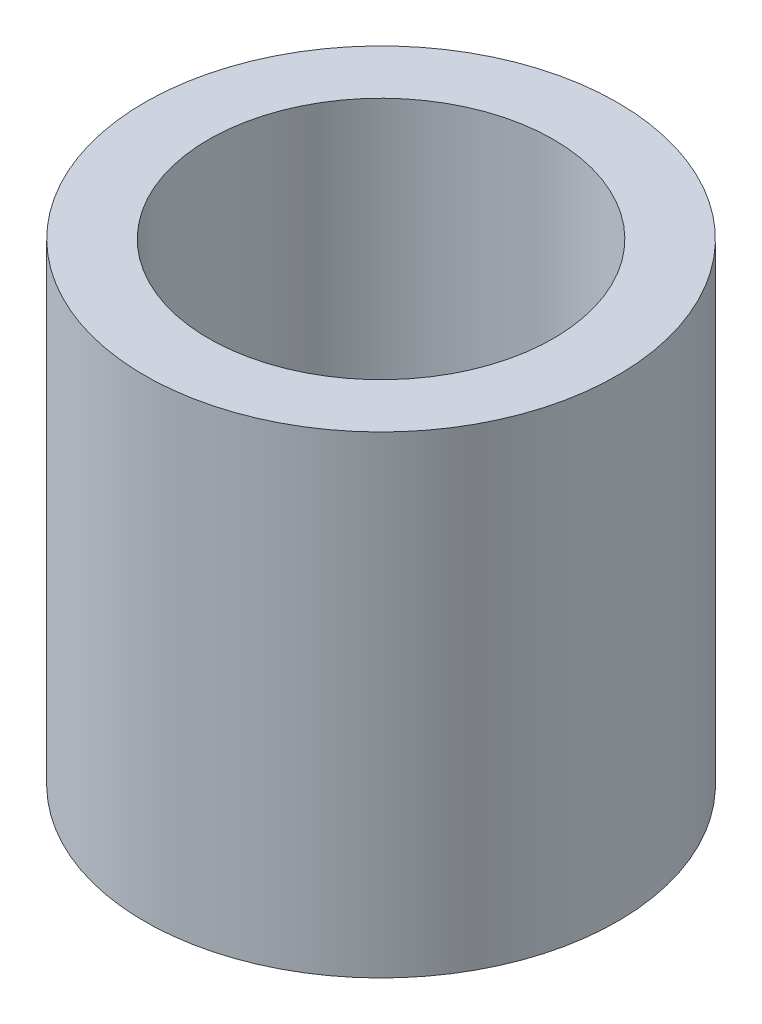
ISO-10303-21;
HEADER;
FILE_DESCRIPTION(('STEP AP214'),'2;1');
FILE_NAME('part.step','',(''),(''),'','','');
FILE_SCHEMA(('AUTOMOTIVE_DESIGN { 1 0 10303 214 1 1 1 1 }'));
ENDSEC;
DATA;
#1=APPLICATION_CONTEXT('core data for automotive mechanical design processes');
#2=APPLICATION_PROTOCOL_DEFINITION('international standard','automotive_design',2000,#1);
#3=PRODUCT_CONTEXT('',#1,'mechanical');
#4=PRODUCT('Part','Part','',(#3));
#5=PRODUCT_RELATED_PRODUCT_CATEGORY('part','',(#4));
#6=PRODUCT_DEFINITION_FORMATION('','',#4);
#7=PRODUCT_DEFINITION_CONTEXT('part definition',#1,'design');
#8=PRODUCT_DEFINITION('design','',#6,#7);
#9=PRODUCT_DEFINITION_SHAPE('','',#8);
#10=(LENGTH_UNIT() NAMED_UNIT(*) SI_UNIT(.MILLI.,.METRE.));
#11=(NAMED_UNIT(*) PLANE_ANGLE_UNIT() SI_UNIT($,.RADIAN.));
#12=(NAMED_UNIT(*) SI_UNIT($,.STERADIAN.) SOLID_ANGLE_UNIT());
#13=UNCERTAINTY_MEASURE_WITH_UNIT(LENGTH_MEASURE(1.E-05),#10,'distance_accuracy_value','');
#14=(GEOMETRIC_REPRESENTATION_CONTEXT(3) GLOBAL_UNCERTAINTY_ASSIGNED_CONTEXT((#13)) GLOBAL_UNIT_ASSIGNED_CONTEXT((#10,
#11,#12)) REPRESENTATION_CONTEXT('',''));
#15=CARTESIAN_POINT('',(0.,0.,0.));
#16=DIRECTION('',(0.,0.,1.));
#17=DIRECTION('',(1.,0.,0.));
#18=AXIS2_PLACEMENT_3D('',#15,#16,#17);
#19=CARTESIAN_POINT('',(0.,0.,0.));
#20=DIRECTION('',(0.,-1.,0.));
#21=DIRECTION('',(0.,0.,-1.));
#22=AXIS2_PLACEMENT_3D('',#19,#20,#21);
#23=CYLINDRICAL_SURFACE('',#22,1.2192);
#24=CARTESIAN_POINT('',(0.,2.4384,0.));
#25=DIRECTION('',(0.,-1.,0.));
#26=DIRECTION('',(0.,0.,-1.));
#27=AXIS2_PLACEMENT_3D('',#24,#25,#26);
#28=CIRCLE('',#27,1.2192);
#29=CARTESIAN_POINT('',(0.,2.4384,-1.2192));
#30=VERTEX_POINT('',#29);
#31=EDGE_CURVE('E10',#30,#30,#28,.T.);
#32=ORIENTED_EDGE('',*,*,#31,.T.);
#33=EDGE_LOOP('',(#32));
#34=FACE_BOUND('',#33,.T.);
#35=CARTESIAN_POINT('',(0.,0.,0.));
#36=DIRECTION('',(0.,-1.,0.));
#37=DIRECTION('',(0.,0.,-1.));
#38=AXIS2_PLACEMENT_3D('',#35,#36,#37);
#39=CIRCLE('',#38,1.2192);
#40=CARTESIAN_POINT('',(0.,0.,-1.2192));
#41=VERTEX_POINT('',#40);
#42=EDGE_CURVE('E46',#41,#41,#39,.T.);
#43=ORIENTED_EDGE('',*,*,#42,.F.);
#44=EDGE_LOOP('',(#43));
#45=FACE_BOUND('',#44,.T.);
#46=ADVANCED_FACE('F32',(#34,#45),#23,.T.);
#47=CARTESIAN_POINT('',(1.2192,2.4384,0.));
#48=DIRECTION('',(0.,1.,0.));
#49=DIRECTION('',(0.,0.,1.));
#50=AXIS2_PLACEMENT_3D('',#47,#48,#49);
#51=PLANE('',#50);
#52=CARTESIAN_POINT('',(0.,2.4384,0.));
#53=DIRECTION('',(0.,-1.,0.));
#54=DIRECTION('',(0.,0.,-1.));
#55=AXIS2_PLACEMENT_3D('',#52,#53,#54);
#56=CIRCLE('',#55,0.889);
#57=CARTESIAN_POINT('',(0.,2.4384,-0.889));
#58=VERTEX_POINT('',#57);
#59=EDGE_CURVE('E38',#58,#58,#56,.T.);
#60=ORIENTED_EDGE('',*,*,#59,.T.);
#61=EDGE_LOOP('',(#60));
#62=FACE_BOUND('',#61,.T.);
#63=ORIENTED_EDGE('',*,*,#31,.F.);
#64=EDGE_LOOP('',(#63));
#65=FACE_BOUND('',#64,.T.);
#66=ADVANCED_FACE('F56',(#62,#65),#51,.T.);
#67=CARTESIAN_POINT('',(0.,0.,0.));
#68=DIRECTION('',(0.,-1.,0.));
#69=DIRECTION('',(0.,0.,-1.));
#70=AXIS2_PLACEMENT_3D('',#67,#68,#69);
#71=CYLINDRICAL_SURFACE('',#70,0.889);
#72=CARTESIAN_POINT('',(0.,0.,0.));
#73=DIRECTION('',(0.,-1.,0.));
#74=DIRECTION('',(0.,0.,-1.));
#75=AXIS2_PLACEMENT_3D('',#72,#73,#74);
#76=CIRCLE('',#75,0.889);
#77=CARTESIAN_POINT('',(0.,0.,-0.889));
#78=VERTEX_POINT('',#77);
#79=EDGE_CURVE('E42',#78,#78,#76,.T.);
#80=ORIENTED_EDGE('',*,*,#79,.T.);
#81=EDGE_LOOP('',(#80));
#82=FACE_BOUND('',#81,.T.);
#83=ORIENTED_EDGE('',*,*,#59,.F.);
#84=EDGE_LOOP('',(#83));
#85=FACE_BOUND('',#84,.T.);
#86=ADVANCED_FACE('F60',(#82,#85),#71,.F.);
#87=CARTESIAN_POINT('',(1.2192,0.,0.));
#88=DIRECTION('',(0.,-1.,0.));
#89=DIRECTION('',(0.,0.,-1.));
#90=AXIS2_PLACEMENT_3D('',#87,#88,#89);
#91=PLANE('',#90);
#92=ORIENTED_EDGE('',*,*,#42,.T.);
#93=EDGE_LOOP('',(#92));
#94=FACE_BOUND('',#93,.T.);
#95=ORIENTED_EDGE('',*,*,#79,.F.);
#96=EDGE_LOOP('',(#95));
#97=FACE_BOUND('',#96,.T.);
#98=ADVANCED_FACE('F52',(#94,#97),#91,.T.);
#99=CLOSED_SHELL('',(#46,#66,#86,#98));
#100=MANIFOLD_SOLID_BREP('B2',#99);
#101=ADVANCED_BREP_SHAPE_REPRESENTATION('',(#18,#100),#14);
#102=SHAPE_DEFINITION_REPRESENTATION(#9,#101);
ENDSEC;
END-ISO-10303-21;
